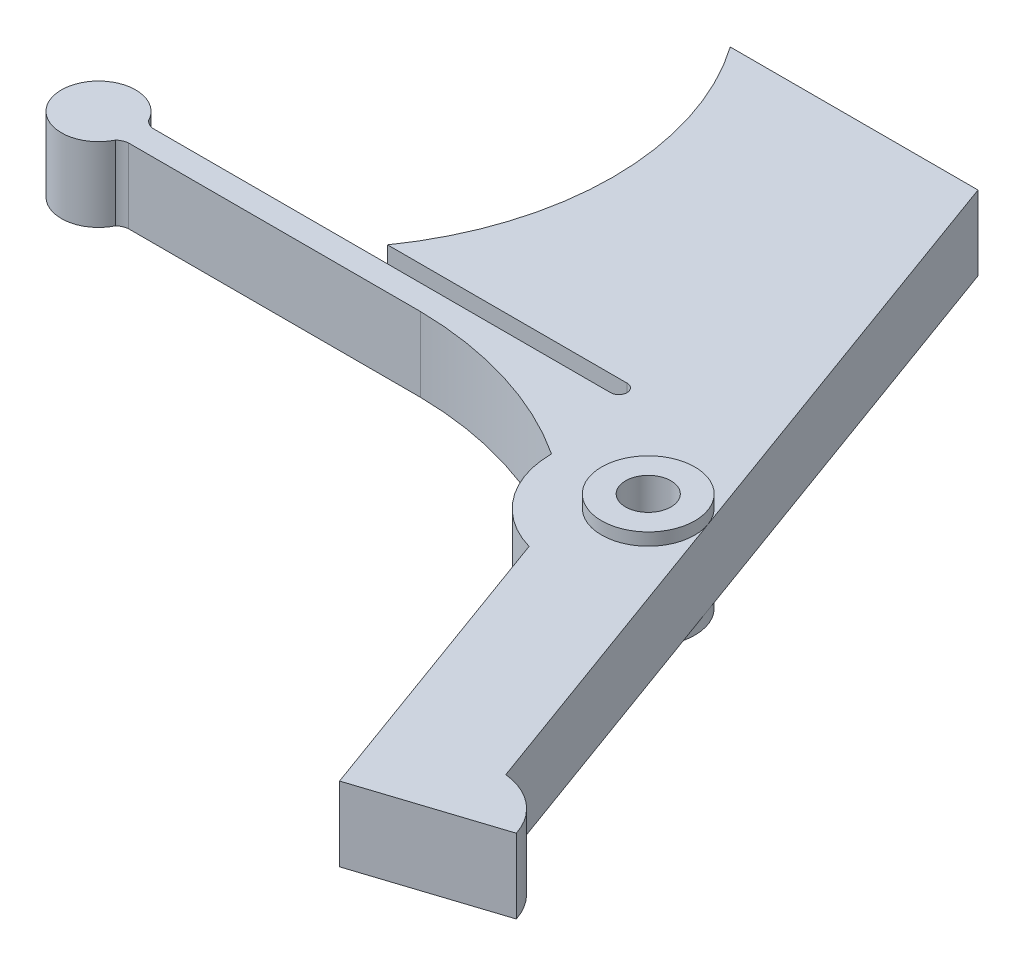
ISO-10303-21;
HEADER;
FILE_DESCRIPTION(('STEP AP214'),'2;1');
FILE_NAME('part.step','',(''),(''),'','','');
FILE_SCHEMA(('AUTOMOTIVE_DESIGN { 1 0 10303 214 1 1 1 1 }'));
ENDSEC;
DATA;
#1=APPLICATION_CONTEXT('core data for automotive mechanical design processes');
#2=APPLICATION_PROTOCOL_DEFINITION('international standard','automotive_design',2000,#1);
#3=PRODUCT_CONTEXT('',#1,'mechanical');
#4=PRODUCT('Part','Part','',(#3));
#5=PRODUCT_RELATED_PRODUCT_CATEGORY('part','',(#4));
#6=PRODUCT_DEFINITION_FORMATION('','',#4);
#7=PRODUCT_DEFINITION_CONTEXT('part definition',#1,'design');
#8=PRODUCT_DEFINITION('design','',#6,#7);
#9=PRODUCT_DEFINITION_SHAPE('','',#8);
#10=(LENGTH_UNIT() NAMED_UNIT(*) SI_UNIT(.MILLI.,.METRE.));
#11=(NAMED_UNIT(*) PLANE_ANGLE_UNIT() SI_UNIT($,.RADIAN.));
#12=(NAMED_UNIT(*) SI_UNIT($,.STERADIAN.) SOLID_ANGLE_UNIT());
#13=UNCERTAINTY_MEASURE_WITH_UNIT(LENGTH_MEASURE(1.E-05),#10,'distance_accuracy_value','');
#14=(GEOMETRIC_REPRESENTATION_CONTEXT(3) GLOBAL_UNCERTAINTY_ASSIGNED_CONTEXT((#13)) GLOBAL_UNIT_ASSIGNED_CONTEXT((#10,
#11,#12)) REPRESENTATION_CONTEXT('',''));
#15=CARTESIAN_POINT('',(0.,0.,0.));
#16=DIRECTION('',(0.,0.,1.));
#17=DIRECTION('',(1.,0.,0.));
#18=AXIS2_PLACEMENT_3D('',#15,#16,#17);
#19=CARTESIAN_POINT('',(-15.24,4.572,-23.9451834887281));
#20=DIRECTION('',(0.,0.,1.));
#21=DIRECTION('',(1.,0.,0.));
#22=AXIS2_PLACEMENT_3D('',#19,#20,#21);
#23=PLANE('',#22);
#24=DIRECTION('',(-1.,0.,0.));
#25=VECTOR('',#24,1.);
#26=CARTESIAN_POINT('',(-15.24,0.,-23.9451834887281));
#27=LINE('',#26,#25);
#28=CARTESIAN_POINT('',(0.,0.,-23.9451834887281));
#29=VERTEX_POINT('',#28);
#30=CARTESIAN_POINT('',(-15.24,0.,-23.9451834887281));
#31=VERTEX_POINT('',#30);
#32=EDGE_CURVE('E195',#29,#31,#27,.T.);
#33=ORIENTED_EDGE('',*,*,#32,.T.);
#34=DIRECTION('',(0.,-1.,0.));
#35=VECTOR('',#34,1.);
#36=CARTESIAN_POINT('',(-15.24,4.572,-23.9451834887281));
#37=LINE('',#36,#35);
#38=CARTESIAN_POINT('',(-15.24,4.572,-23.9451834887281));
#39=VERTEX_POINT('',#38);
#40=EDGE_CURVE('E11',#39,#31,#37,.T.);
#41=ORIENTED_EDGE('',*,*,#40,.F.);
#42=DIRECTION('',(-1.,0.,0.));
#43=VECTOR('',#42,1.);
#44=CARTESIAN_POINT('',(-15.24,4.572,-23.9451834887281));
#45=LINE('',#44,#43);
#46=CARTESIAN_POINT('',(0.,4.572,-23.9451834887281));
#47=VERTEX_POINT('',#46);
#48=EDGE_CURVE('E241',#47,#39,#45,.T.);
#49=ORIENTED_EDGE('',*,*,#48,.F.);
#50=DIRECTION('',(0.,-1.,0.));
#51=VECTOR('',#50,1.);
#52=CARTESIAN_POINT('',(0.,4.572,-23.9451834887281));
#53=LINE('',#52,#51);
#54=EDGE_CURVE('E194',#47,#29,#53,.T.);
#55=ORIENTED_EDGE('',*,*,#54,.T.);
#56=EDGE_LOOP('',(#33,#41,#49,#55));
#57=FACE_BOUND('',#56,.T.);
#58=ADVANCED_FACE('F39',(#57),#23,.F.);
#59=CARTESIAN_POINT('',(-30.2729221374046,4.572,-13.4041834887281));
#60=DIRECTION('',(0.,-1.,0.));
#61=DIRECTION('',(0.,0.,-1.));
#62=AXIS2_PLACEMENT_3D('',#59,#60,#61);
#63=CYLINDRICAL_SURFACE('',#62,18.3603221374046);
#64=CARTESIAN_POINT('',(-30.2729221374046,0.,-13.4041834887281));
#65=DIRECTION('',(0.,-1.,0.));
#66=DIRECTION('',(0.,0.,1.));
#67=AXIS2_PLACEMENT_3D('',#64,#65,#66);
#68=CIRCLE('',#67,18.3603221374046);
#69=CARTESIAN_POINT('',(-15.24,0.,-2.86318348872814));
#70=VERTEX_POINT('',#69);
#71=EDGE_CURVE('E199',#31,#70,#68,.T.);
#72=ORIENTED_EDGE('',*,*,#71,.T.);
#73=DIRECTION('',(0.,-1.,0.));
#74=VECTOR('',#73,1.);
#75=CARTESIAN_POINT('',(-15.24,4.572,-2.86318348872814));
#76=LINE('',#75,#74);
#77=CARTESIAN_POINT('',(-15.24,4.572,-2.86318348872814));
#78=VERTEX_POINT('',#77);
#79=EDGE_CURVE('E48',#78,#70,#76,.T.);
#80=ORIENTED_EDGE('',*,*,#79,.F.);
#81=CARTESIAN_POINT('',(-30.2729221374046,4.572,-13.4041834887281));
#82=DIRECTION('',(0.,-1.,0.));
#83=DIRECTION('',(0.,0.,1.));
#84=AXIS2_PLACEMENT_3D('',#81,#82,#83);
#85=CIRCLE('',#84,18.3603221374046);
#86=EDGE_CURVE('E123',#39,#78,#85,.T.);
#87=ORIENTED_EDGE('',*,*,#86,.F.);
#88=ORIENTED_EDGE('',*,*,#40,.T.);
#89=EDGE_LOOP('',(#72,#80,#87,#88));
#90=FACE_BOUND('',#89,.T.);
#91=ADVANCED_FACE('F361',(#90),#63,.F.);
#92=CARTESIAN_POINT('',(-0.507999999999997,4.572,-2.86318348872814));
#93=DIRECTION('',(0.,0.,-1.));
#94=DIRECTION('',(-1.,0.,0.));
#95=AXIS2_PLACEMENT_3D('',#92,#93,#94);
#96=PLANE('',#95);
#97=DIRECTION('',(1.,0.,0.));
#98=VECTOR('',#97,1.);
#99=CARTESIAN_POINT('',(-0.507999999999997,0.,-2.86318348872814));
#100=LINE('',#99,#98);
#101=CARTESIAN_POINT('',(-0.507999999999997,0.,-2.86318348872814));
#102=VERTEX_POINT('',#101);
#103=EDGE_CURVE('E203',#70,#102,#100,.T.);
#104=ORIENTED_EDGE('',*,*,#103,.T.);
#105=DIRECTION('',(0.,-1.,0.));
#106=VECTOR('',#105,1.);
#107=CARTESIAN_POINT('',(-0.507999999999997,4.572,-2.86318348872814));
#108=LINE('',#107,#106);
#109=CARTESIAN_POINT('',(-0.507999999999997,4.572,-2.86318348872814));
#110=VERTEX_POINT('',#109);
#111=EDGE_CURVE('E280',#110,#102,#108,.T.);
#112=ORIENTED_EDGE('',*,*,#111,.F.);
#113=DIRECTION('',(1.,0.,0.));
#114=VECTOR('',#113,1.);
#115=CARTESIAN_POINT('',(-0.507999999999997,4.572,-2.86318348872814));
#116=LINE('',#115,#114);
#117=EDGE_CURVE('E291',#78,#110,#116,.T.);
#118=ORIENTED_EDGE('',*,*,#117,.F.);
#119=ORIENTED_EDGE('',*,*,#79,.T.);
#120=EDGE_LOOP('',(#104,#112,#118,#119));
#121=FACE_BOUND('',#120,.T.);
#122=ADVANCED_FACE('F289',(#121),#96,.F.);
#123=CARTESIAN_POINT('',(-0.507999999999997,4.572,-2.35518348872814));
#124=DIRECTION('',(0.,-1.,0.));
#125=DIRECTION('',(0.,0.,-1.));
#126=AXIS2_PLACEMENT_3D('',#123,#124,#125);
#127=CYLINDRICAL_SURFACE('',#126,0.508);
#128=CARTESIAN_POINT('',(-0.507999999999997,0.,-2.35518348872814));
#129=DIRECTION('',(0.,-1.,0.));
#130=DIRECTION('',(0.,0.,1.));
#131=AXIS2_PLACEMENT_3D('',#128,#129,#130);
#132=CIRCLE('',#131,0.508);
#133=CARTESIAN_POINT('',(-0.507999999999997,0.,-1.84718348872814));
#134=VERTEX_POINT('',#133);
#135=EDGE_CURVE('E206',#102,#134,#132,.T.);
#136=ORIENTED_EDGE('',*,*,#135,.T.);
#137=DIRECTION('',(0.,-1.,0.));
#138=VECTOR('',#137,1.);
#139=CARTESIAN_POINT('',(-0.507999999999997,4.572,-1.84718348872814));
#140=LINE('',#139,#138);
#141=CARTESIAN_POINT('',(-0.507999999999997,4.572,-1.84718348872814));
#142=VERTEX_POINT('',#141);
#143=EDGE_CURVE('E276',#142,#134,#140,.T.);
#144=ORIENTED_EDGE('',*,*,#143,.F.);
#145=CARTESIAN_POINT('',(-0.507999999999997,4.572,-2.35518348872814));
#146=DIRECTION('',(0.,-1.,0.));
#147=DIRECTION('',(0.,0.,1.));
#148=AXIS2_PLACEMENT_3D('',#145,#146,#147);
#149=CIRCLE('',#148,0.508);
#150=EDGE_CURVE('E310',#110,#142,#149,.T.);
#151=ORIENTED_EDGE('',*,*,#150,.F.);
#152=ORIENTED_EDGE('',*,*,#111,.T.);
#153=EDGE_LOOP('',(#136,#144,#151,#152));
#154=FACE_BOUND('',#153,.T.);
#155=ADVANCED_FACE('F300',(#154),#127,.F.);
#156=CARTESIAN_POINT('',(-0.507999999999997,4.572,-1.84718348872814));
#157=DIRECTION('',(0.,0.,1.));
#158=DIRECTION('',(1.,0.,0.));
#159=AXIS2_PLACEMENT_3D('',#156,#157,#158);
#160=PLANE('',#159);
#161=DIRECTION('',(-1.,0.,0.));
#162=VECTOR('',#161,1.);
#163=CARTESIAN_POINT('',(-0.507999999999997,0.,-1.84718348872814));
#164=LINE('',#163,#162);
#165=CARTESIAN_POINT('',(-28.6791004044403,0.,-1.84718348872814));
#166=VERTEX_POINT('',#165);
#167=EDGE_CURVE('E209',#134,#166,#164,.T.);
#168=ORIENTED_EDGE('',*,*,#167,.T.);
#169=DIRECTION('',(0.,-1.,0.));
#170=VECTOR('',#169,1.);
#171=CARTESIAN_POINT('',(-28.6791004044403,4.572,-1.84718348872814));
#172=LINE('',#171,#170);
#173=CARTESIAN_POINT('',(-28.6791004044403,4.572,-1.84718348872814));
#174=VERTEX_POINT('',#173);
#175=EDGE_CURVE('E272',#174,#166,#172,.T.);
#176=ORIENTED_EDGE('',*,*,#175,.F.);
#177=DIRECTION('',(-1.,0.,0.));
#178=VECTOR('',#177,1.);
#179=CARTESIAN_POINT('',(-0.507999999999997,4.572,-1.84718348872814));
#180=LINE('',#179,#178);
#181=EDGE_CURVE('E306',#142,#174,#180,.T.);
#182=ORIENTED_EDGE('',*,*,#181,.F.);
#183=ORIENTED_EDGE('',*,*,#143,.T.);
#184=EDGE_LOOP('',(#168,#176,#182,#183));
#185=FACE_BOUND('',#184,.T.);
#186=ADVANCED_FACE('F304',(#185),#160,.F.);
#187=CARTESIAN_POINT('',(-28.5194057922062,4.572,-2.78855604298824));
#188=DIRECTION('',(0.,-1.,0.));
#189=DIRECTION('',(0.,0.,-1.));
#190=AXIS2_PLACEMENT_3D('',#187,#188,#189);
#191=CYLINDRICAL_SURFACE('',#190,0.954821792320843);
#192=CARTESIAN_POINT('',(-28.5194057922062,0.,-2.78855604298824));
#193=DIRECTION('',(0.,-1.,0.));
#194=DIRECTION('',(0.,0.,-1.));
#195=AXIS2_PLACEMENT_3D('',#192,#193,#194);
#196=CIRCLE('',#195,0.954821792320843);
#197=CARTESIAN_POINT('',(-29.2064019984971,0.,-2.12544152223588));
#198=VERTEX_POINT('',#197);
#199=EDGE_CURVE('E212',#166,#198,#196,.T.);
#200=ORIENTED_EDGE('',*,*,#199,.T.);
#201=DIRECTION('',(0.,-1.,0.));
#202=VECTOR('',#201,1.);
#203=CARTESIAN_POINT('',(-29.2064019984971,4.572,-2.12544152223588));
#204=LINE('',#203,#202);
#205=CARTESIAN_POINT('',(-29.2064019984971,4.572,-2.12544152223588));
#206=VERTEX_POINT('',#205);
#207=EDGE_CURVE('E268',#206,#198,#204,.T.);
#208=ORIENTED_EDGE('',*,*,#207,.F.);
#209=CARTESIAN_POINT('',(-28.5194057922062,4.572,-2.78855604298824));
#210=DIRECTION('',(0.,-1.,0.));
#211=DIRECTION('',(0.,0.,-1.));
#212=AXIS2_PLACEMENT_3D('',#209,#210,#211);
#213=CIRCLE('',#212,0.954821792320843);
#214=EDGE_CURVE('E309',#174,#206,#213,.T.);
#215=ORIENTED_EDGE('',*,*,#214,.F.);
#216=ORIENTED_EDGE('',*,*,#175,.T.);
#217=EDGE_LOOP('',(#200,#208,#215,#216));
#218=FACE_BOUND('',#217,.T.);
#219=ADVANCED_FACE('F373',(#218),#191,.F.);
#220=CARTESIAN_POINT('',(-31.242,4.572,-1.08518348872814));
#221=DIRECTION('',(0.,-1.,0.));
#222=DIRECTION('',(0.,0.,-1.));
#223=AXIS2_PLACEMENT_3D('',#220,#221,#222);
#224=CYLINDRICAL_SURFACE('',#223,2.286);
#225=CARTESIAN_POINT('',(-31.242,0.,-1.08518348872814));
#226=DIRECTION('',(0.,1.,0.));
#227=DIRECTION('',(0.,0.,1.));
#228=AXIS2_PLACEMENT_3D('',#225,#226,#227);
#229=CIRCLE('',#228,2.286);
#230=CARTESIAN_POINT('',(-29.1919130402763,0.,-0.0737787934796236));
#231=VERTEX_POINT('',#230);
#232=EDGE_CURVE('E215',#198,#231,#229,.T.);
#233=ORIENTED_EDGE('',*,*,#232,.T.);
#234=DIRECTION('',(0.,-1.,0.));
#235=VECTOR('',#234,1.);
#236=CARTESIAN_POINT('',(-29.1919130402763,4.572,-0.0737787934796236));
#237=LINE('',#236,#235);
#238=CARTESIAN_POINT('',(-29.1919130402763,4.572,-0.0737787934796236));
#239=VERTEX_POINT('',#238);
#240=EDGE_CURVE('E264',#239,#231,#237,.T.);
#241=ORIENTED_EDGE('',*,*,#240,.F.);
#242=CARTESIAN_POINT('',(-31.242,4.572,-1.08518348872814));
#243=DIRECTION('',(0.,1.,0.));
#244=DIRECTION('',(0.,0.,1.));
#245=AXIS2_PLACEMENT_3D('',#242,#243,#244);
#246=CIRCLE('',#245,2.286);
#247=EDGE_CURVE('E314',#206,#239,#246,.T.);
#248=ORIENTED_EDGE('',*,*,#247,.F.);
#249=ORIENTED_EDGE('',*,*,#207,.T.);
#250=EDGE_LOOP('',(#233,#241,#248,#249));
#251=FACE_BOUND('',#250,.T.);
#252=ADVANCED_FACE('F376',(#251),#224,.T.);
#253=CARTESIAN_POINT('',(-28.541692600618,4.572,0.625433645584088));
#254=DIRECTION('',(0.,-1.,0.));
#255=DIRECTION('',(0.,0.,-1.));
#256=AXIS2_PLACEMENT_3D('',#253,#254,#255);
#257=CYLINDRICAL_SURFACE('',#256,0.954821792320844);
#258=CARTESIAN_POINT('',(-28.541692600618,0.,0.625433645584088));
#259=DIRECTION('',(0.,-1.,0.));
#260=DIRECTION('',(0.,0.,-1.));
#261=AXIS2_PLACEMENT_3D('',#258,#259,#260);
#262=CIRCLE('',#261,0.954821792320844);
#263=CARTESIAN_POINT('',(-28.6503672875513,0.,-0.32318348872814));
#264=VERTEX_POINT('',#263);
#265=EDGE_CURVE('E218',#231,#264,#262,.T.);
#266=ORIENTED_EDGE('',*,*,#265,.T.);
#267=DIRECTION('',(0.,-1.,0.));
#268=VECTOR('',#267,1.);
#269=CARTESIAN_POINT('',(-28.6503672875513,4.572,-0.32318348872814));
#270=LINE('',#269,#268);
#271=CARTESIAN_POINT('',(-28.6503672875513,4.572,-0.32318348872814));
#272=VERTEX_POINT('',#271);
#273=EDGE_CURVE('E260',#272,#264,#270,.T.);
#274=ORIENTED_EDGE('',*,*,#273,.F.);
#275=CARTESIAN_POINT('',(-28.541692600618,4.572,0.625433645584088));
#276=DIRECTION('',(0.,-1.,0.));
#277=DIRECTION('',(0.,0.,-1.));
#278=AXIS2_PLACEMENT_3D('',#275,#276,#277);
#279=CIRCLE('',#278,0.954821792320844);
#280=EDGE_CURVE('E321',#239,#272,#279,.T.);
#281=ORIENTED_EDGE('',*,*,#280,.F.);
#282=ORIENTED_EDGE('',*,*,#240,.T.);
#283=EDGE_LOOP('',(#266,#274,#281,#282));
#284=FACE_BOUND('',#283,.T.);
#285=ADVANCED_FACE('F380',(#284),#257,.F.);
#286=CARTESIAN_POINT('',(-28.6503672875513,4.572,-0.32318348872814));
#287=DIRECTION('',(0.,0.,-1.));
#288=DIRECTION('',(-1.,0.,0.));
#289=AXIS2_PLACEMENT_3D('',#286,#287,#288);
#290=PLANE('',#289);
#291=DIRECTION('',(1.,0.,0.));
#292=VECTOR('',#291,1.);
#293=CARTESIAN_POINT('',(-28.6503672875513,0.,-0.32318348872814));
#294=LINE('',#293,#292);
#295=CARTESIAN_POINT('',(-10.668,0.,-0.323183488728136));
#296=VERTEX_POINT('',#295);
#297=EDGE_CURVE('E221',#264,#296,#294,.T.);
#298=ORIENTED_EDGE('',*,*,#297,.T.);
#299=DIRECTION('',(0.,-1.,0.));
#300=VECTOR('',#299,1.);
#301=CARTESIAN_POINT('',(-10.668,4.572,-0.323183488728136));
#302=LINE('',#301,#300);
#303=CARTESIAN_POINT('',(-10.668,4.572,-0.323183488728136));
#304=VERTEX_POINT('',#303);
#305=EDGE_CURVE('E256',#304,#296,#302,.T.);
#306=ORIENTED_EDGE('',*,*,#305,.F.);
#307=DIRECTION('',(1.,0.,0.));
#308=VECTOR('',#307,1.);
#309=CARTESIAN_POINT('',(-28.6503672875513,4.572,-0.32318348872814));
#310=LINE('',#309,#308);
#311=EDGE_CURVE('E324',#272,#304,#310,.T.);
#312=ORIENTED_EDGE('',*,*,#311,.F.);
#313=ORIENTED_EDGE('',*,*,#273,.T.);
#314=EDGE_LOOP('',(#298,#306,#312,#313));
#315=FACE_BOUND('',#314,.T.);
#316=ADVANCED_FACE('F384',(#315),#290,.F.);
#317=CARTESIAN_POINT('',(-10.9567988402466,4.572,21.3488801484773));
#318=DIRECTION('',(0.,-1.,0.));
#319=DIRECTION('',(0.,0.,-1.));
#320=AXIS2_PLACEMENT_3D('',#317,#318,#319);
#321=CYLINDRICAL_SURFACE('',#320,21.673987797939);
#322=CARTESIAN_POINT('',(-10.9567988402466,0.,21.3488801484773));
#323=DIRECTION('',(0.,-1.,0.));
#324=DIRECTION('',(0.,0.,1.));
#325=AXIS2_PLACEMENT_3D('',#322,#323,#324);
#326=CIRCLE('',#325,21.673987797939);
#327=CARTESIAN_POINT('',(0.941519753484734,0.,3.2328165112719));
#328=VERTEX_POINT('',#327);
#329=EDGE_CURVE('E224',#296,#328,#326,.T.);
#330=ORIENTED_EDGE('',*,*,#329,.T.);
#331=DIRECTION('',(0.,-1.,0.));
#332=VECTOR('',#331,1.);
#333=CARTESIAN_POINT('',(0.941519753484734,4.572,3.2328165112719));
#334=LINE('',#333,#332);
#335=CARTESIAN_POINT('',(0.941519753484734,4.572,3.2328165112719));
#336=VERTEX_POINT('',#335);
#337=EDGE_CURVE('E252',#336,#328,#334,.T.);
#338=ORIENTED_EDGE('',*,*,#337,.F.);
#339=CARTESIAN_POINT('',(-10.9567988402466,4.572,21.3488801484773));
#340=DIRECTION('',(0.,-1.,0.));
#341=DIRECTION('',(0.,0.,1.));
#342=AXIS2_PLACEMENT_3D('',#339,#340,#341);
#343=CIRCLE('',#342,21.673987797939);
#344=EDGE_CURVE('E327',#304,#336,#343,.T.);
#345=ORIENTED_EDGE('',*,*,#344,.F.);
#346=ORIENTED_EDGE('',*,*,#305,.T.);
#347=EDGE_LOOP('',(#330,#338,#345,#346));
#348=FACE_BOUND('',#347,.T.);
#349=ADVANCED_FACE('F388',(#348),#321,.F.);
#350=CARTESIAN_POINT('',(6.78351975348473,4.572,3.23281651127186));
#351=DIRECTION('',(0.,-1.,0.));
#352=DIRECTION('',(0.,0.,-1.));
#353=AXIS2_PLACEMENT_3D('',#350,#351,#352);
#354=CYLINDRICAL_SURFACE('',#353,5.842);
#355=CARTESIAN_POINT('',(6.78351975348473,0.,3.23281651127186));
#356=DIRECTION('',(0.,1.,0.));
#357=DIRECTION('',(0.,0.,1.));
#358=AXIS2_PLACEMENT_3D('',#355,#356,#357);
#359=CIRCLE('',#358,5.842);
#360=CARTESIAN_POINT('',(5.17899755601282,0.,8.85015329286328));
#361=VERTEX_POINT('',#360);
#362=EDGE_CURVE('E227',#328,#361,#359,.T.);
#363=ORIENTED_EDGE('',*,*,#362,.T.);
#364=DIRECTION('',(0.,-1.,0.));
#365=VECTOR('',#364,1.);
#366=CARTESIAN_POINT('',(5.17899755601282,4.572,8.85015329286328));
#367=LINE('',#366,#365);
#368=CARTESIAN_POINT('',(5.17899755601282,4.572,8.85015329286328));
#369=VERTEX_POINT('',#368);
#370=EDGE_CURVE('E248',#369,#361,#367,.T.);
#371=ORIENTED_EDGE('',*,*,#370,.F.);
#372=CARTESIAN_POINT('',(6.78351975348473,4.572,3.23281651127186));
#373=DIRECTION('',(0.,1.,0.));
#374=DIRECTION('',(0.,0.,1.));
#375=AXIS2_PLACEMENT_3D('',#372,#373,#374);
#376=CIRCLE('',#375,5.842);
#377=EDGE_CURVE('E330',#336,#369,#376,.T.);
#378=ORIENTED_EDGE('',*,*,#377,.F.);
#379=ORIENTED_EDGE('',*,*,#337,.T.);
#380=EDGE_LOOP('',(#363,#371,#378,#379));
#381=FACE_BOUND('',#380,.T.);
#382=ADVANCED_FACE('F338',(#381),#354,.T.);
#383=CARTESIAN_POINT('',(11.850067084486,4.572,27.1787661859551));
#384=DIRECTION('',(0.939692620785908,0.,-0.342020143325669));
#385=DIRECTION('',(-0.342020143325669,0.,-0.939692620785908));
#386=AXIS2_PLACEMENT_3D('',#383,#384,#385);
#387=PLANE('',#386);
#388=DIRECTION('',(0.342020143325669,0.,0.939692620785908));
#389=VECTOR('',#388,1.);
#390=CARTESIAN_POINT('',(11.850067084486,0.,27.1787661859551));
#391=LINE('',#390,#389);
#392=CARTESIAN_POINT('',(11.850067084486,0.,27.1787661859551));
#393=VERTEX_POINT('',#392);
#394=EDGE_CURVE('E230',#361,#393,#391,.T.);
#395=ORIENTED_EDGE('',*,*,#394,.T.);
#396=DIRECTION('',(0.,-1.,0.));
#397=VECTOR('',#396,1.);
#398=CARTESIAN_POINT('',(11.850067084486,4.572,27.1787661859551));
#399=LINE('',#398,#397);
#400=CARTESIAN_POINT('',(11.850067084486,4.572,27.1787661859551));
#401=VERTEX_POINT('',#400);
#402=EDGE_CURVE('E180',#401,#393,#399,.T.);
#403=ORIENTED_EDGE('',*,*,#402,.F.);
#404=DIRECTION('',(0.342020143325669,0.,0.939692620785908));
#405=VECTOR('',#404,1.);
#406=CARTESIAN_POINT('',(11.850067084486,4.572,27.1787661859551));
#407=LINE('',#406,#405);
#408=EDGE_CURVE('E166',#369,#401,#407,.T.);
#409=ORIENTED_EDGE('',*,*,#408,.F.);
#410=ORIENTED_EDGE('',*,*,#370,.T.);
#411=EDGE_LOOP('',(#395,#403,#409,#410));
#412=FACE_BOUND('',#411,.T.);
#413=ADVANCED_FACE('F342',(#412),#387,.F.);
#414=CARTESIAN_POINT('',(11.850067084486,4.572,27.1787661859551));
#415=DIRECTION('',(-0.307746276622542,0.,-0.951468459395771));
#416=DIRECTION('',(-0.951468459395771,0.,0.307746276622542));
#417=AXIS2_PLACEMENT_3D('',#414,#415,#416);
#418=PLANE('',#417);
#419=DIRECTION('',(0.951468459395771,0.,-0.307746276622542));
#420=VECTOR('',#419,1.);
#421=CARTESIAN_POINT('',(11.850067084486,0.,27.1787661859551));
#422=LINE('',#421,#420);
#423=CARTESIAN_POINT('',(20.0669486998279,0.,24.5210693410428));
#424=VERTEX_POINT('',#423);
#425=EDGE_CURVE('E176',#393,#424,#422,.T.);
#426=ORIENTED_EDGE('',*,*,#425,.T.);
#427=DIRECTION('',(0.,-1.,0.));
#428=VECTOR('',#427,1.);
#429=CARTESIAN_POINT('',(20.0669486998279,4.572,24.5210693410428));
#430=LINE('',#429,#428);
#431=CARTESIAN_POINT('',(20.0669486998279,4.572,24.5210693410428));
#432=VERTEX_POINT('',#431);
#433=EDGE_CURVE('E173',#432,#424,#430,.T.);
#434=ORIENTED_EDGE('',*,*,#433,.F.);
#435=DIRECTION('',(0.951468459395771,0.,-0.307746276622542));
#436=VECTOR('',#435,1.);
#437=CARTESIAN_POINT('',(11.850067084486,4.572,27.1787661859551));
#438=LINE('',#437,#436);
#439=EDGE_CURVE('E158',#401,#432,#438,.T.);
#440=ORIENTED_EDGE('',*,*,#439,.F.);
#441=ORIENTED_EDGE('',*,*,#402,.T.);
#442=EDGE_LOOP('',(#426,#434,#440,#441));
#443=FACE_BOUND('',#442,.T.);
#444=ADVANCED_FACE('F174',(#443),#418,.F.);
#445=CARTESIAN_POINT('',(16.1897011289506,4.572,25.7751398167358));
#446=DIRECTION('',(0.,-1.,0.));
#447=DIRECTION('',(0.,0.,-1.));
#448=AXIS2_PLACEMENT_3D('',#445,#446,#447);
#449=CYLINDRICAL_SURFACE('',#448,4.07501429247537);
#450=CARTESIAN_POINT('',(16.1897011289506,0.,25.7751398167358));
#451=DIRECTION('',(0.,1.,0.));
#452=DIRECTION('',(0.,0.,1.));
#453=AXIS2_PLACEMENT_3D('',#450,#451,#452);
#454=CIRCLE('',#453,4.07501429247537);
#455=CARTESIAN_POINT('',(16.6218994593588,0.,21.723109944305));
#456=VERTEX_POINT('',#455);
#457=EDGE_CURVE('E235',#424,#456,#454,.T.);
#458=ORIENTED_EDGE('',*,*,#457,.T.);
#459=DIRECTION('',(0.,-1.,0.));
#460=VECTOR('',#459,1.);
#461=CARTESIAN_POINT('',(16.6218994593588,4.572,21.723109944305));
#462=LINE('',#461,#460);
#463=CARTESIAN_POINT('',(16.6218994593588,4.572,21.723109944305));
#464=VERTEX_POINT('',#463);
#465=EDGE_CURVE('E181',#464,#456,#462,.T.);
#466=ORIENTED_EDGE('',*,*,#465,.F.);
#467=CARTESIAN_POINT('',(16.1897011289506,4.572,25.7751398167358));
#468=DIRECTION('',(0.,1.,0.));
#469=DIRECTION('',(0.,0.,1.));
#470=AXIS2_PLACEMENT_3D('',#467,#468,#469);
#471=CIRCLE('',#470,4.07501429247537);
#472=EDGE_CURVE('E163',#432,#464,#471,.T.);
#473=ORIENTED_EDGE('',*,*,#472,.F.);
#474=ORIENTED_EDGE('',*,*,#433,.T.);
#475=EDGE_LOOP('',(#458,#466,#473,#474));
#476=FACE_BOUND('',#475,.T.);
#477=ADVANCED_FACE('F183',(#476),#449,.T.);
#478=CARTESIAN_POINT('',(0.,4.572,-23.9451834887281));
#479=DIRECTION('',(-0.939692620785908,0.,0.342020143325669));
#480=DIRECTION('',(0.342020143325669,0.,0.939692620785908));
#481=AXIS2_PLACEMENT_3D('',#478,#479,#480);
#482=PLANE('',#481);
#483=DIRECTION('',(-0.342020143325669,0.,-0.939692620785908));
#484=VECTOR('',#483,1.);
#485=CARTESIAN_POINT('',(0.,0.,-23.9451834887281));
#486=LINE('',#485,#484);
#487=CARTESIAN_POINT('',(9.50397140154468,0.,2.16676333215833));
#488=VERTEX_POINT('',#487);
#489=EDGE_CURVE('E238',#456,#488,#486,.T.);
#490=ORIENTED_EDGE('',*,*,#489,.T.);
#491=EDGE_CURVE('E115',#488,#29,#486,.T.);
#492=ORIENTED_EDGE('',*,*,#491,.T.);
#493=ORIENTED_EDGE('',*,*,#54,.F.);
#494=DIRECTION('',(-0.342020143325669,0.,-0.939692620785908));
#495=VECTOR('',#494,1.);
#496=CARTESIAN_POINT('',(0.,4.572,-23.9451834887281));
#497=LINE('',#496,#495);
#498=CARTESIAN_POINT('',(9.50397140154468,4.572,2.16676333215833));
#499=VERTEX_POINT('',#498);
#500=EDGE_CURVE('E60',#499,#47,#497,.T.);
#501=ORIENTED_EDGE('',*,*,#500,.F.);
#502=EDGE_CURVE('E189',#464,#499,#497,.T.);
#503=ORIENTED_EDGE('',*,*,#502,.F.);
#504=ORIENTED_EDGE('',*,*,#465,.T.);
#505=EDGE_LOOP('',(#490,#492,#493,#501,#503,#504));
#506=FACE_BOUND('',#505,.T.);
#507=ADVANCED_FACE('F344',(#506),#482,.F.);
#508=CARTESIAN_POINT('',(16.1897011289506,4.572,25.7751398167358));
#509=DIRECTION('',(0.,1.,0.));
#510=DIRECTION('',(0.,0.,1.));
#511=AXIS2_PLACEMENT_3D('',#508,#509,#510);
#512=PLANE('',#511);
#513=ORIENTED_EDGE('',*,*,#502,.T.);
#514=CARTESIAN_POINT('',(6.80771180774985,4.572,3.14812156815433));
#515=DIRECTION('',(0.,1.,0.));
#516=DIRECTION('',(0.,0.,1.));
#517=AXIS2_PLACEMENT_3D('',#514,#515,#516);
#518=CIRCLE('',#517,2.86929952854139);
#519=EDGE_CURVE('E200',#499,#499,#518,.T.);
#520=ORIENTED_EDGE('',*,*,#519,.F.);
#521=ORIENTED_EDGE('',*,*,#500,.T.);
#522=ORIENTED_EDGE('',*,*,#48,.T.);
#523=ORIENTED_EDGE('',*,*,#86,.T.);
#524=ORIENTED_EDGE('',*,*,#117,.T.);
#525=ORIENTED_EDGE('',*,*,#150,.T.);
#526=ORIENTED_EDGE('',*,*,#181,.T.);
#527=ORIENTED_EDGE('',*,*,#214,.T.);
#528=ORIENTED_EDGE('',*,*,#247,.T.);
#529=ORIENTED_EDGE('',*,*,#280,.T.);
#530=ORIENTED_EDGE('',*,*,#311,.T.);
#531=ORIENTED_EDGE('',*,*,#344,.T.);
#532=ORIENTED_EDGE('',*,*,#377,.T.);
#533=ORIENTED_EDGE('',*,*,#408,.T.);
#534=ORIENTED_EDGE('',*,*,#439,.T.);
#535=ORIENTED_EDGE('',*,*,#472,.T.);
#536=EDGE_LOOP('',(#513,#520,#521,#522,#523,#524,#525,#526,#527,#528,#529,#530,#531,#532,#533,
#534,#535));
#537=FACE_BOUND('',#536,.T.);
#538=ADVANCED_FACE('F161',(#537),#512,.T.);
#539=CARTESIAN_POINT('',(16.1897011289506,0.,25.7751398167358));
#540=DIRECTION('',(0.,1.,0.));
#541=DIRECTION('',(0.,0.,1.));
#542=AXIS2_PLACEMENT_3D('',#539,#540,#541);
#543=PLANE('',#542);
#544=ORIENTED_EDGE('',*,*,#491,.F.);
#545=CARTESIAN_POINT('',(6.80771180774985,0.,3.14812156815433));
#546=DIRECTION('',(0.,1.,0.));
#547=DIRECTION('',(0.,0.,1.));
#548=AXIS2_PLACEMENT_3D('',#545,#546,#547);
#549=CIRCLE('',#548,2.86929952854139);
#550=EDGE_CURVE('E42',#488,#488,#549,.T.);
#551=ORIENTED_EDGE('',*,*,#550,.T.);
#552=ORIENTED_EDGE('',*,*,#489,.F.);
#553=ORIENTED_EDGE('',*,*,#457,.F.);
#554=ORIENTED_EDGE('',*,*,#425,.F.);
#555=ORIENTED_EDGE('',*,*,#394,.F.);
#556=ORIENTED_EDGE('',*,*,#362,.F.);
#557=ORIENTED_EDGE('',*,*,#329,.F.);
#558=ORIENTED_EDGE('',*,*,#297,.F.);
#559=ORIENTED_EDGE('',*,*,#265,.F.);
#560=ORIENTED_EDGE('',*,*,#232,.F.);
#561=ORIENTED_EDGE('',*,*,#199,.F.);
#562=ORIENTED_EDGE('',*,*,#167,.F.);
#563=ORIENTED_EDGE('',*,*,#135,.F.);
#564=ORIENTED_EDGE('',*,*,#103,.F.);
#565=ORIENTED_EDGE('',*,*,#71,.F.);
#566=ORIENTED_EDGE('',*,*,#32,.F.);
#567=EDGE_LOOP('',(#544,#551,#552,#553,#554,#555,#556,#557,#558,#559,#560,#561,#562,#563,#564,
#565,#566));
#568=FACE_BOUND('',#567,.T.);
#569=ADVANCED_FACE('F294',(#568),#543,.F.);
#570=CARTESIAN_POINT('',(6.80771180774985,-0.762,3.14812156815433));
#571=DIRECTION('',(0.,1.,0.));
#572=DIRECTION('',(0.,0.,1.));
#573=AXIS2_PLACEMENT_3D('',#570,#571,#572);
#574=PLANE('',#573);
#575=CARTESIAN_POINT('',(6.80771180774985,-0.762,3.14812156815433));
#576=DIRECTION('',(0.,1.,0.));
#577=DIRECTION('',(0.,0.,1.));
#578=AXIS2_PLACEMENT_3D('',#575,#576,#577);
#579=CIRCLE('',#578,1.397);
#580=CARTESIAN_POINT('',(6.80771180774985,-0.762,4.54512156815433));
#581=VERTEX_POINT('',#580);
#582=EDGE_CURVE('E427',#581,#581,#579,.T.);
#583=ORIENTED_EDGE('',*,*,#582,.T.);
#584=EDGE_LOOP('',(#583));
#585=FACE_BOUND('',#584,.T.);
#586=CARTESIAN_POINT('',(6.80771180774985,-0.762,3.14812156815433));
#587=DIRECTION('',(0.,1.,0.));
#588=DIRECTION('',(0.,0.,1.));
#589=AXIS2_PLACEMENT_3D('',#586,#587,#588);
#590=CIRCLE('',#589,2.86929952854139);
#591=CARTESIAN_POINT('',(6.80771180774985,-0.762,6.01742109669572));
#592=VERTEX_POINT('',#591);
#593=EDGE_CURVE('E350',#592,#592,#590,.T.);
#594=ORIENTED_EDGE('',*,*,#593,.F.);
#595=EDGE_LOOP('',(#594));
#596=FACE_BOUND('',#595,.T.);
#597=ADVANCED_FACE('F405',(#585,#596),#574,.F.);
#598=CARTESIAN_POINT('',(6.80771180774985,-0.762,3.14812156815433));
#599=DIRECTION('',(0.,1.,0.));
#600=DIRECTION('',(0.,0.,1.));
#601=AXIS2_PLACEMENT_3D('',#598,#599,#600);
#602=CYLINDRICAL_SURFACE('',#601,2.86929952854139);
#603=ORIENTED_EDGE('',*,*,#593,.T.);
#604=EDGE_LOOP('',(#603));
#605=FACE_BOUND('',#604,.T.);
#606=ORIENTED_EDGE('',*,*,#550,.F.);
#607=EDGE_LOOP('',(#606));
#608=FACE_BOUND('',#607,.T.);
#609=ADVANCED_FACE('F412',(#605,#608),#602,.T.);
#610=ORIENTED_EDGE('',*,*,#519,.T.);
#611=EDGE_LOOP('',(#610));
#612=FACE_BOUND('',#611,.T.);
#613=CARTESIAN_POINT('',(6.80771180774985,5.334,3.14812156815433));
#614=DIRECTION('',(0.,1.,0.));
#615=DIRECTION('',(0.,0.,1.));
#616=AXIS2_PLACEMENT_3D('',#613,#614,#615);
#617=CIRCLE('',#616,2.86929952854139);
#618=CARTESIAN_POINT('',(6.80771180774985,5.334,6.01742109669572));
#619=VERTEX_POINT('',#618);
#620=EDGE_CURVE('E434',#619,#619,#617,.T.);
#621=ORIENTED_EDGE('',*,*,#620,.F.);
#622=EDGE_LOOP('',(#621));
#623=FACE_BOUND('',#622,.T.);
#624=ADVANCED_FACE('F408',(#612,#623),#602,.T.);
#625=CARTESIAN_POINT('',(6.80771180774985,5.334,3.14812156815433));
#626=DIRECTION('',(0.,1.,0.));
#627=DIRECTION('',(0.,0.,1.));
#628=AXIS2_PLACEMENT_3D('',#625,#626,#627);
#629=PLANE('',#628);
#630=CARTESIAN_POINT('',(6.80771180774985,5.334,3.14812156815433));
#631=DIRECTION('',(0.,1.,0.));
#632=DIRECTION('',(0.,0.,1.));
#633=AXIS2_PLACEMENT_3D('',#630,#631,#632);
#634=CIRCLE('',#633,1.397);
#635=CARTESIAN_POINT('',(6.80771180774985,5.334,4.54512156815433));
#636=VERTEX_POINT('',#635);
#637=EDGE_CURVE('E430',#636,#636,#634,.T.);
#638=ORIENTED_EDGE('',*,*,#637,.F.);
#639=EDGE_LOOP('',(#638));
#640=FACE_BOUND('',#639,.T.);
#641=ORIENTED_EDGE('',*,*,#620,.T.);
#642=EDGE_LOOP('',(#641));
#643=FACE_BOUND('',#642,.T.);
#644=ADVANCED_FACE('F411',(#640,#643),#629,.T.);
#645=CARTESIAN_POINT('',(6.80771180774985,-0.762,3.14812156815433));
#646=DIRECTION('',(0.,1.,0.));
#647=DIRECTION('',(0.,0.,1.));
#648=AXIS2_PLACEMENT_3D('',#645,#646,#647);
#649=CYLINDRICAL_SURFACE('',#648,1.397);
#650=ORIENTED_EDGE('',*,*,#582,.F.);
#651=EDGE_LOOP('',(#650));
#652=FACE_BOUND('',#651,.T.);
#653=ORIENTED_EDGE('',*,*,#637,.T.);
#654=EDGE_LOOP('',(#653));
#655=FACE_BOUND('',#654,.T.);
#656=ADVANCED_FACE('F418',(#652,#655),#649,.F.);
#657=CLOSED_SHELL('',(#58,#91,#122,#155,#186,#219,#252,#285,#316,#349,#382,#413,#444,#477,#507,
#538,#569,#597,#609,#624,#644,#656));
#658=MANIFOLD_SOLID_BREP('B2',#657);
#659=ADVANCED_BREP_SHAPE_REPRESENTATION('',(#18,#658),#14);
#660=SHAPE_DEFINITION_REPRESENTATION(#9,#659);
ENDSEC;
END-ISO-10303-21;
